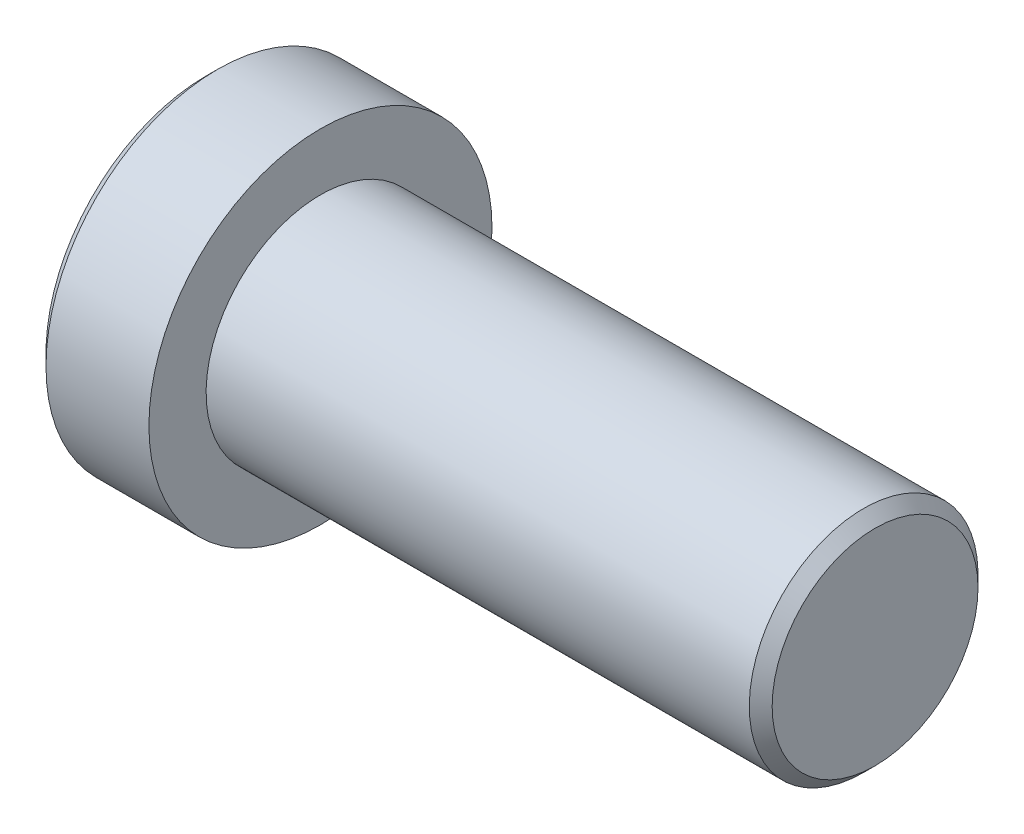
ISO-10303-21;
HEADER;
FILE_DESCRIPTION(('STEP AP214'),'2;1');
FILE_NAME('part.step','',(''),(''),'','','');
FILE_SCHEMA(('AUTOMOTIVE_DESIGN { 1 0 10303 214 1 1 1 1 }'));
ENDSEC;
DATA;
#1=APPLICATION_CONTEXT('core data for automotive mechanical design processes');
#2=APPLICATION_PROTOCOL_DEFINITION('international standard','automotive_design',2000,#1);
#3=PRODUCT_CONTEXT('',#1,'mechanical');
#4=PRODUCT('Part','Part','',(#3));
#5=PRODUCT_RELATED_PRODUCT_CATEGORY('part','',(#4));
#6=PRODUCT_DEFINITION_FORMATION('','',#4);
#7=PRODUCT_DEFINITION_CONTEXT('part definition',#1,'design');
#8=PRODUCT_DEFINITION('design','',#6,#7);
#9=PRODUCT_DEFINITION_SHAPE('','',#8);
#10=(LENGTH_UNIT() NAMED_UNIT(*) SI_UNIT(.MILLI.,.METRE.));
#11=(NAMED_UNIT(*) PLANE_ANGLE_UNIT() SI_UNIT($,.RADIAN.));
#12=(NAMED_UNIT(*) SI_UNIT($,.STERADIAN.) SOLID_ANGLE_UNIT());
#13=UNCERTAINTY_MEASURE_WITH_UNIT(LENGTH_MEASURE(1.E-05),#10,'distance_accuracy_value','');
#14=(GEOMETRIC_REPRESENTATION_CONTEXT(3) GLOBAL_UNCERTAINTY_ASSIGNED_CONTEXT((#13)) GLOBAL_UNIT_ASSIGNED_CONTEXT((#10,
#11,#12)) REPRESENTATION_CONTEXT('',''));
#15=CARTESIAN_POINT('',(0.,0.,0.));
#16=DIRECTION('',(0.,0.,1.));
#17=DIRECTION('',(1.,0.,0.));
#18=AXIS2_PLACEMENT_3D('',#15,#16,#17);
#19=CARTESIAN_POINT('',(0.,0.,0.));
#20=DIRECTION('',(1.,0.,0.));
#21=DIRECTION('',(0.,1.,0.));
#22=AXIS2_PLACEMENT_3D('',#19,#20,#21);
#23=PLANE('',#22);
#24=CARTESIAN_POINT('',(0.,0.,0.));
#25=DIRECTION('',(1.,0.,0.));
#26=DIRECTION('',(0.,1.,0.));
#27=AXIS2_PLACEMENT_3D('',#24,#25,#26);
#28=CIRCLE('',#27,2.8);
#29=CARTESIAN_POINT('',(0.,2.8,0.));
#30=VERTEX_POINT('',#29);
#31=EDGE_CURVE('E60',#30,#30,#28,.F.);
#32=ORIENTED_EDGE('',*,*,#31,.T.);
#33=EDGE_LOOP('',(#32));
#34=FACE_BOUND('',#33,.T.);
#35=DIRECTION('',(0.,-0.5,-0.866025403784439));
#36=VECTOR('',#35,1.);
#37=CARTESIAN_POINT('',(0.,2.,0.));
#38=LINE('',#37,#36);
#39=CARTESIAN_POINT('',(0.,2.,0.));
#40=VERTEX_POINT('',#39);
#41=CARTESIAN_POINT('',(0.,0.999999999999999,-1.73205080756888));
#42=VERTEX_POINT('',#41);
#43=EDGE_CURVE('E141',#40,#42,#38,.T.);
#44=ORIENTED_EDGE('',*,*,#43,.F.);
#45=DIRECTION('',(0.,0.5,-0.866025403784439));
#46=VECTOR('',#45,1.);
#47=CARTESIAN_POINT('',(0.,1.,1.73205080756887));
#48=LINE('',#47,#46);
#49=CARTESIAN_POINT('',(0.,1.,1.73205080756887));
#50=VERTEX_POINT('',#49);
#51=EDGE_CURVE('E67',#50,#40,#48,.T.);
#52=ORIENTED_EDGE('',*,*,#51,.F.);
#53=DIRECTION('',(0.,1.,0.));
#54=VECTOR('',#53,1.);
#55=CARTESIAN_POINT('',(0.,-0.999999999999999,1.73205080756887));
#56=LINE('',#55,#54);
#57=CARTESIAN_POINT('',(0.,-0.999999999999999,1.73205080756887));
#58=VERTEX_POINT('',#57);
#59=EDGE_CURVE('E150',#58,#50,#56,.T.);
#60=ORIENTED_EDGE('',*,*,#59,.F.);
#61=DIRECTION('',(0.,0.5,0.866025403784439));
#62=VECTOR('',#61,1.);
#63=CARTESIAN_POINT('',(0.,-2.,0.));
#64=LINE('',#63,#62);
#65=CARTESIAN_POINT('',(0.,-2.,0.));
#66=VERTEX_POINT('',#65);
#67=EDGE_CURVE('E148',#66,#58,#64,.T.);
#68=ORIENTED_EDGE('',*,*,#67,.F.);
#69=DIRECTION('',(0.,-0.5,0.866025403784439));
#70=VECTOR('',#69,1.);
#71=CARTESIAN_POINT('',(0.,-0.999999999999999,-1.73205080756888));
#72=LINE('',#71,#70);
#73=CARTESIAN_POINT('',(0.,-0.999999999999999,-1.73205080756888));
#74=VERTEX_POINT('',#73);
#75=EDGE_CURVE('E115',#74,#66,#72,.T.);
#76=ORIENTED_EDGE('',*,*,#75,.F.);
#77=DIRECTION('',(0.,-1.,0.));
#78=VECTOR('',#77,1.);
#79=CARTESIAN_POINT('',(0.,0.999999999999999,-1.73205080756888));
#80=LINE('',#79,#78);
#81=EDGE_CURVE('E144',#42,#74,#80,.T.);
#82=ORIENTED_EDGE('',*,*,#81,.F.);
#83=EDGE_LOOP('',(#44,#52,#60,#68,#76,#82));
#84=FACE_BOUND('',#83,.T.);
#85=ADVANCED_FACE('F51',(#34,#84),#23,.F.);
#86=CARTESIAN_POINT('',(0.,0.,0.));
#87=DIRECTION('',(-1.,0.,0.));
#88=DIRECTION('',(0.,-1.,0.));
#89=AXIS2_PLACEMENT_3D('',#86,#87,#88);
#90=CYLINDRICAL_SURFACE('',#89,3.);
#91=CARTESIAN_POINT('',(0.2,0.,0.));
#92=DIRECTION('',(1.,0.,0.));
#93=DIRECTION('',(0.,1.,0.));
#94=AXIS2_PLACEMENT_3D('',#91,#92,#93);
#95=CIRCLE('',#94,3.);
#96=CARTESIAN_POINT('',(0.2,3.,0.));
#97=VERTEX_POINT('',#96);
#98=EDGE_CURVE('E11',#97,#97,#95,.T.);
#99=ORIENTED_EDGE('',*,*,#98,.T.);
#100=EDGE_LOOP('',(#99));
#101=FACE_BOUND('',#100,.T.);
#102=CARTESIAN_POINT('',(2.,0.,0.));
#103=DIRECTION('',(-1.,0.,0.));
#104=DIRECTION('',(0.,-1.,0.));
#105=AXIS2_PLACEMENT_3D('',#102,#103,#104);
#106=CIRCLE('',#105,3.);
#107=CARTESIAN_POINT('',(2.,-3.,0.));
#108=VERTEX_POINT('',#107);
#109=EDGE_CURVE('E162',#108,#108,#106,.T.);
#110=ORIENTED_EDGE('',*,*,#109,.T.);
#111=EDGE_LOOP('',(#110));
#112=FACE_BOUND('',#111,.T.);
#113=ADVANCED_FACE('F185',(#101,#112),#90,.T.);
#114=CARTESIAN_POINT('',(2.,3.,0.));
#115=DIRECTION('',(-1.,0.,0.));
#116=DIRECTION('',(0.,-1.,0.));
#117=AXIS2_PLACEMENT_3D('',#114,#115,#116);
#118=PLANE('',#117);
#119=ORIENTED_EDGE('',*,*,#109,.F.);
#120=EDGE_LOOP('',(#119));
#121=FACE_BOUND('',#120,.T.);
#122=CARTESIAN_POINT('',(2.,0.,0.));
#123=DIRECTION('',(-1.,0.,0.));
#124=DIRECTION('',(0.,-1.,0.));
#125=AXIS2_PLACEMENT_3D('',#122,#123,#124);
#126=CIRCLE('',#125,2.);
#127=CARTESIAN_POINT('',(2.,-2.,0.));
#128=VERTEX_POINT('',#127);
#129=EDGE_CURVE('E154',#128,#128,#126,.T.);
#130=ORIENTED_EDGE('',*,*,#129,.T.);
#131=EDGE_LOOP('',(#130));
#132=FACE_BOUND('',#131,.T.);
#133=ADVANCED_FACE('F192',(#121,#132),#118,.F.);
#134=CARTESIAN_POINT('',(0.,0.,0.));
#135=DIRECTION('',(-1.,0.,0.));
#136=DIRECTION('',(0.,-1.,0.));
#137=AXIS2_PLACEMENT_3D('',#134,#135,#136);
#138=CYLINDRICAL_SURFACE('',#137,2.);
#139=CARTESIAN_POINT('',(11.5,0.,0.));
#140=DIRECTION('',(-1.,0.,0.));
#141=DIRECTION('',(0.,-1.,0.));
#142=AXIS2_PLACEMENT_3D('',#139,#140,#141);
#143=CIRCLE('',#142,2.);
#144=CARTESIAN_POINT('',(11.5,-2.,0.));
#145=VERTEX_POINT('',#144);
#146=EDGE_CURVE('E165',#145,#145,#143,.T.);
#147=ORIENTED_EDGE('',*,*,#146,.T.);
#148=EDGE_LOOP('',(#147));
#149=FACE_BOUND('',#148,.T.);
#150=ORIENTED_EDGE('',*,*,#129,.F.);
#151=EDGE_LOOP('',(#150));
#152=FACE_BOUND('',#151,.T.);
#153=ADVANCED_FACE('F203',(#149,#152),#138,.T.);
#154=CARTESIAN_POINT('',(11.7,2.,0.));
#155=DIRECTION('',(-1.,0.,0.));
#156=DIRECTION('',(0.,-1.,0.));
#157=AXIS2_PLACEMENT_3D('',#154,#155,#156);
#158=PLANE('',#157);
#159=CARTESIAN_POINT('',(11.7,0.,0.));
#160=DIRECTION('',(-1.,0.,0.));
#161=DIRECTION('',(0.,-1.,0.));
#162=AXIS2_PLACEMENT_3D('',#159,#160,#161);
#163=CIRCLE('',#162,1.8);
#164=CARTESIAN_POINT('',(11.7,-1.8,0.));
#165=VERTEX_POINT('',#164);
#166=EDGE_CURVE('E168',#165,#165,#163,.F.);
#167=ORIENTED_EDGE('',*,*,#166,.T.);
#168=EDGE_LOOP('',(#167));
#169=FACE_BOUND('',#168,.T.);
#170=ADVANCED_FACE('F207',(#169),#158,.F.);
#171=CARTESIAN_POINT('',(1.5,1.,1.73205080756887));
#172=DIRECTION('',(0.,0.866025403784439,0.5));
#173=DIRECTION('',(0.,-0.5,0.866025403784439));
#174=AXIS2_PLACEMENT_3D('',#171,#172,#173);
#175=PLANE('',#174);
#176=ORIENTED_EDGE('',*,*,#51,.T.);
#177=DIRECTION('',(-1.,0.,0.));
#178=VECTOR('',#177,1.);
#179=CARTESIAN_POINT('',(1.5,2.,0.));
#180=LINE('',#179,#178);
#181=CARTESIAN_POINT('',(1.5,2.,0.));
#182=VERTEX_POINT('',#181);
#183=EDGE_CURVE('E97',#182,#40,#180,.T.);
#184=ORIENTED_EDGE('',*,*,#183,.F.);
#185=DIRECTION('',(0.,0.5,-0.866025403784439));
#186=VECTOR('',#185,1.);
#187=CARTESIAN_POINT('',(1.5,1.,1.73205080756887));
#188=LINE('',#187,#186);
#189=CARTESIAN_POINT('',(1.5,1.,1.73205080756887));
#190=VERTEX_POINT('',#189);
#191=EDGE_CURVE('E152',#190,#182,#188,.T.);
#192=ORIENTED_EDGE('',*,*,#191,.F.);
#193=DIRECTION('',(-1.,0.,0.));
#194=VECTOR('',#193,1.);
#195=CARTESIAN_POINT('',(1.5,1.,1.73205080756887));
#196=LINE('',#195,#194);
#197=EDGE_CURVE('E75',#190,#50,#196,.T.);
#198=ORIENTED_EDGE('',*,*,#197,.T.);
#199=EDGE_LOOP('',(#176,#184,#192,#198));
#200=FACE_BOUND('',#199,.T.);
#201=ADVANCED_FACE('F211',(#200),#175,.F.);
#202=CARTESIAN_POINT('',(1.5,-0.999999999999999,1.73205080756887));
#203=DIRECTION('',(0.,0.,1.));
#204=DIRECTION('',(0.,-1.,0.));
#205=AXIS2_PLACEMENT_3D('',#202,#203,#204);
#206=PLANE('',#205);
#207=ORIENTED_EDGE('',*,*,#59,.T.);
#208=ORIENTED_EDGE('',*,*,#197,.F.);
#209=DIRECTION('',(0.,1.,0.));
#210=VECTOR('',#209,1.);
#211=CARTESIAN_POINT('',(1.5,-0.999999999999999,1.73205080756887));
#212=LINE('',#211,#210);
#213=CARTESIAN_POINT('',(1.5,-0.999999999999999,1.73205080756887));
#214=VERTEX_POINT('',#213);
#215=EDGE_CURVE('E127',#214,#190,#212,.T.);
#216=ORIENTED_EDGE('',*,*,#215,.F.);
#217=DIRECTION('',(-1.,0.,0.));
#218=VECTOR('',#217,1.);
#219=CARTESIAN_POINT('',(1.5,-0.999999999999999,1.73205080756887));
#220=LINE('',#219,#218);
#221=EDGE_CURVE('E119',#214,#58,#220,.T.);
#222=ORIENTED_EDGE('',*,*,#221,.T.);
#223=EDGE_LOOP('',(#207,#208,#216,#222));
#224=FACE_BOUND('',#223,.T.);
#225=ADVANCED_FACE('F215',(#224),#206,.F.);
#226=CARTESIAN_POINT('',(1.5,-2.,0.));
#227=DIRECTION('',(0.,-0.866025403784439,0.5));
#228=DIRECTION('',(0.,-0.5,-0.866025403784439));
#229=AXIS2_PLACEMENT_3D('',#226,#227,#228);
#230=PLANE('',#229);
#231=ORIENTED_EDGE('',*,*,#67,.T.);
#232=ORIENTED_EDGE('',*,*,#221,.F.);
#233=DIRECTION('',(0.,0.5,0.866025403784439));
#234=VECTOR('',#233,1.);
#235=CARTESIAN_POINT('',(1.5,-2.,0.));
#236=LINE('',#235,#234);
#237=CARTESIAN_POINT('',(1.5,-2.,0.));
#238=VERTEX_POINT('',#237);
#239=EDGE_CURVE('E123',#238,#214,#236,.T.);
#240=ORIENTED_EDGE('',*,*,#239,.F.);
#241=DIRECTION('',(-1.,0.,0.));
#242=VECTOR('',#241,1.);
#243=CARTESIAN_POINT('',(1.5,-2.,0.));
#244=LINE('',#243,#242);
#245=EDGE_CURVE('E108',#238,#66,#244,.T.);
#246=ORIENTED_EDGE('',*,*,#245,.T.);
#247=EDGE_LOOP('',(#231,#232,#240,#246));
#248=FACE_BOUND('',#247,.T.);
#249=ADVANCED_FACE('F124',(#248),#230,.F.);
#250=CARTESIAN_POINT('',(1.5,-0.999999999999999,-1.73205080756888));
#251=DIRECTION('',(0.,-0.866025403784439,-0.5));
#252=DIRECTION('',(0.,0.5,-0.866025403784439));
#253=AXIS2_PLACEMENT_3D('',#250,#251,#252);
#254=PLANE('',#253);
#255=ORIENTED_EDGE('',*,*,#75,.T.);
#256=ORIENTED_EDGE('',*,*,#245,.F.);
#257=DIRECTION('',(0.,-0.5,0.866025403784439));
#258=VECTOR('',#257,1.);
#259=CARTESIAN_POINT('',(1.5,-0.999999999999999,-1.73205080756888));
#260=LINE('',#259,#258);
#261=CARTESIAN_POINT('',(1.5,-0.999999999999999,-1.73205080756888));
#262=VERTEX_POINT('',#261);
#263=EDGE_CURVE('E112',#262,#238,#260,.T.);
#264=ORIENTED_EDGE('',*,*,#263,.F.);
#265=DIRECTION('',(-1.,0.,0.));
#266=VECTOR('',#265,1.);
#267=CARTESIAN_POINT('',(1.5,-0.999999999999999,-1.73205080756888));
#268=LINE('',#267,#266);
#269=EDGE_CURVE('E120',#262,#74,#268,.T.);
#270=ORIENTED_EDGE('',*,*,#269,.T.);
#271=EDGE_LOOP('',(#255,#256,#264,#270));
#272=FACE_BOUND('',#271,.T.);
#273=ADVANCED_FACE('F110',(#272),#254,.F.);
#274=CARTESIAN_POINT('',(1.5,0.999999999999999,-1.73205080756888));
#275=DIRECTION('',(0.,0.,-1.));
#276=DIRECTION('',(0.,1.,0.));
#277=AXIS2_PLACEMENT_3D('',#274,#275,#276);
#278=PLANE('',#277);
#279=ORIENTED_EDGE('',*,*,#81,.T.);
#280=ORIENTED_EDGE('',*,*,#269,.F.);
#281=DIRECTION('',(0.,-1.,0.));
#282=VECTOR('',#281,1.);
#283=CARTESIAN_POINT('',(1.5,0.999999999999999,-1.73205080756888));
#284=LINE('',#283,#282);
#285=CARTESIAN_POINT('',(1.5,0.999999999999999,-1.73205080756888));
#286=VERTEX_POINT('',#285);
#287=EDGE_CURVE('E133',#286,#262,#284,.T.);
#288=ORIENTED_EDGE('',*,*,#287,.F.);
#289=DIRECTION('',(-1.,0.,0.));
#290=VECTOR('',#289,1.);
#291=CARTESIAN_POINT('',(1.5,0.999999999999999,-1.73205080756888));
#292=LINE('',#291,#290);
#293=EDGE_CURVE('E157',#286,#42,#292,.T.);
#294=ORIENTED_EDGE('',*,*,#293,.T.);
#295=EDGE_LOOP('',(#279,#280,#288,#294));
#296=FACE_BOUND('',#295,.T.);
#297=ADVANCED_FACE('F219',(#296),#278,.F.);
#298=CARTESIAN_POINT('',(1.5,2.,0.));
#299=DIRECTION('',(0.,0.866025403784439,-0.5));
#300=DIRECTION('',(0.,0.5,0.866025403784439));
#301=AXIS2_PLACEMENT_3D('',#298,#299,#300);
#302=PLANE('',#301);
#303=ORIENTED_EDGE('',*,*,#43,.T.);
#304=ORIENTED_EDGE('',*,*,#293,.F.);
#305=DIRECTION('',(0.,-0.5,-0.866025403784439));
#306=VECTOR('',#305,1.);
#307=CARTESIAN_POINT('',(1.5,2.,0.));
#308=LINE('',#307,#306);
#309=EDGE_CURVE('E135',#182,#286,#308,.T.);
#310=ORIENTED_EDGE('',*,*,#309,.F.);
#311=ORIENTED_EDGE('',*,*,#183,.T.);
#312=EDGE_LOOP('',(#303,#304,#310,#311));
#313=FACE_BOUND('',#312,.T.);
#314=ADVANCED_FACE('F216',(#313),#302,.F.);
#315=CARTESIAN_POINT('',(1.5,0.,0.));
#316=DIRECTION('',(-1.,0.,0.));
#317=DIRECTION('',(0.,-1.,0.));
#318=AXIS2_PLACEMENT_3D('',#315,#316,#317);
#319=PLANE('',#318);
#320=ORIENTED_EDGE('',*,*,#191,.T.);
#321=ORIENTED_EDGE('',*,*,#309,.T.);
#322=ORIENTED_EDGE('',*,*,#287,.T.);
#323=ORIENTED_EDGE('',*,*,#263,.T.);
#324=ORIENTED_EDGE('',*,*,#239,.T.);
#325=ORIENTED_EDGE('',*,*,#215,.T.);
#326=EDGE_LOOP('',(#320,#321,#322,#323,#324,#325));
#327=FACE_BOUND('',#326,.T.);
#328=ADVANCED_FACE('F130',(#327),#319,.T.);
#329=CARTESIAN_POINT('',(11.5,0.,0.));
#330=DIRECTION('',(-1.,0.,0.));
#331=DIRECTION('',(0.,-1.,0.));
#332=AXIS2_PLACEMENT_3D('',#329,#330,#331);
#333=CONICAL_SURFACE('',#332,2.,0.785398163397444);
#334=ORIENTED_EDGE('',*,*,#166,.F.);
#335=EDGE_LOOP('',(#334));
#336=FACE_BOUND('',#335,.T.);
#337=ORIENTED_EDGE('',*,*,#146,.F.);
#338=EDGE_LOOP('',(#337));
#339=FACE_BOUND('',#338,.T.);
#340=ADVANCED_FACE('F176',(#336,#339),#333,.T.);
#341=CARTESIAN_POINT('',(0.,0.,0.));
#342=DIRECTION('',(1.,0.,0.));
#343=DIRECTION('',(0.,1.,0.));
#344=AXIS2_PLACEMENT_3D('',#341,#342,#343);
#345=CONICAL_SURFACE('',#344,2.8,0.785398163397447);
#346=ORIENTED_EDGE('',*,*,#98,.F.);
#347=EDGE_LOOP('',(#346));
#348=FACE_BOUND('',#347,.T.);
#349=ORIENTED_EDGE('',*,*,#31,.F.);
#350=EDGE_LOOP('',(#349));
#351=FACE_BOUND('',#350,.T.);
#352=ADVANCED_FACE('F54',(#348,#351),#345,.T.);
#353=CLOSED_SHELL('',(#85,#113,#133,#153,#170,#201,#225,#249,#273,#297,#314,#328,#340,#352));
#354=MANIFOLD_SOLID_BREP('B2',#353);
#355=ADVANCED_BREP_SHAPE_REPRESENTATION('',(#18,#354),#14);
#356=SHAPE_DEFINITION_REPRESENTATION(#9,#355);
ENDSEC;
END-ISO-10303-21;
